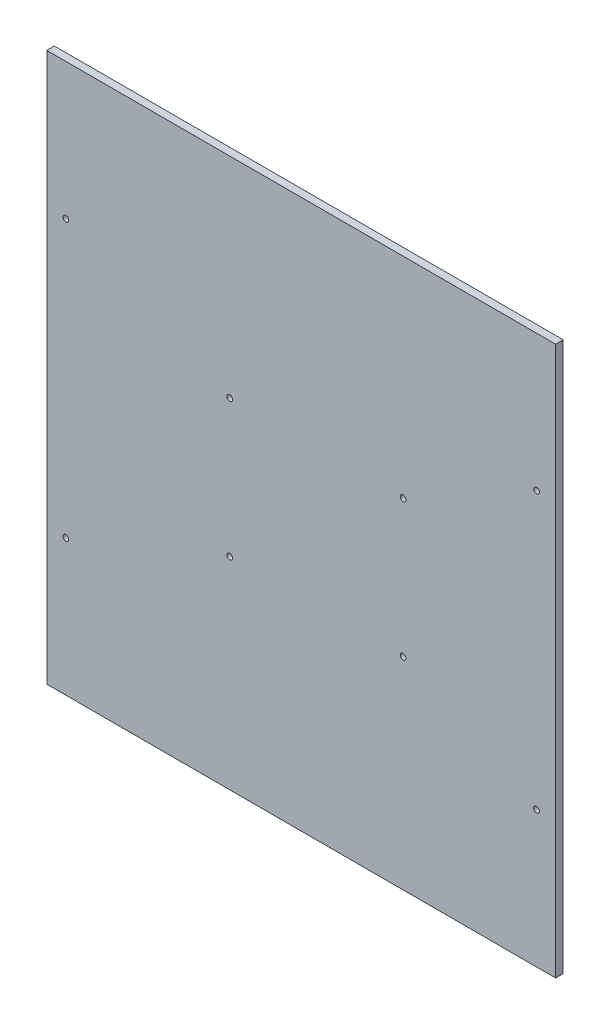
ISO-10303-21;
HEADER;
FILE_DESCRIPTION(('STEP AP214'),'2;1');
FILE_NAME('part.step','',(''),(''),'','','');
FILE_SCHEMA(('AUTOMOTIVE_DESIGN { 1 0 10303 214 1 1 1 1 }'));
ENDSEC;
DATA;
#1=APPLICATION_CONTEXT('core data for automotive mechanical design processes');
#2=APPLICATION_PROTOCOL_DEFINITION('international standard','automotive_design',2000,#1);
#3=PRODUCT_CONTEXT('',#1,'mechanical');
#4=PRODUCT('Part','Part','',(#3));
#5=PRODUCT_RELATED_PRODUCT_CATEGORY('part','',(#4));
#6=PRODUCT_DEFINITION_FORMATION('','',#4);
#7=PRODUCT_DEFINITION_CONTEXT('part definition',#1,'design');
#8=PRODUCT_DEFINITION('design','',#6,#7);
#9=PRODUCT_DEFINITION_SHAPE('','',#8);
#10=(LENGTH_UNIT() NAMED_UNIT(*) SI_UNIT(.MILLI.,.METRE.));
#11=(NAMED_UNIT(*) PLANE_ANGLE_UNIT() SI_UNIT($,.RADIAN.));
#12=(NAMED_UNIT(*) SI_UNIT($,.STERADIAN.) SOLID_ANGLE_UNIT());
#13=UNCERTAINTY_MEASURE_WITH_UNIT(LENGTH_MEASURE(1.E-05),#10,'distance_accuracy_value','');
#14=(GEOMETRIC_REPRESENTATION_CONTEXT(3) GLOBAL_UNCERTAINTY_ASSIGNED_CONTEXT((#13)) GLOBAL_UNIT_ASSIGNED_CONTEXT((#10,
#11,#12)) REPRESENTATION_CONTEXT('',''));
#15=CARTESIAN_POINT('',(0.,0.,0.));
#16=DIRECTION('',(0.,0.,1.));
#17=DIRECTION('',(1.,0.,0.));
#18=AXIS2_PLACEMENT_3D('',#15,#16,#17);
#19=CARTESIAN_POINT('',(-9.99999999999998,-34.3558338694737,4.));
#20=DIRECTION('',(0.,0.,1.));
#21=DIRECTION('',(1.,0.,0.));
#22=AXIS2_PLACEMENT_3D('',#19,#20,#21);
#23=PLANE('',#22);
#24=CARTESIAN_POINT('',(86.0000000000001,71.6441661305263,4.));
#25=DIRECTION('',(0.,0.,1.));
#26=DIRECTION('',(1.,0.,0.));
#27=AXIS2_PLACEMENT_3D('',#24,#25,#26);
#28=CIRCLE('',#27,1.5);
#29=CARTESIAN_POINT('',(87.5000000000001,71.6441661305263,4.));
#30=VERTEX_POINT('',#29);
#31=EDGE_CURVE('E127',#30,#30,#28,.T.);
#32=ORIENTED_EDGE('',*,*,#31,.F.);
#33=EDGE_LOOP('',(#32));
#34=FACE_BOUND('',#33,.T.);
#35=CARTESIAN_POINT('',(177.,71.6441661305263,4.));
#36=DIRECTION('',(0.,0.,1.));
#37=DIRECTION('',(1.,0.,0.));
#38=AXIS2_PLACEMENT_3D('',#35,#36,#37);
#39=CIRCLE('',#38,1.5);
#40=CARTESIAN_POINT('',(178.5,71.6441661305263,4.));
#41=VERTEX_POINT('',#40);
#42=EDGE_CURVE('E117',#41,#41,#39,.T.);
#43=ORIENTED_EDGE('',*,*,#42,.F.);
#44=EDGE_LOOP('',(#43));
#45=FACE_BOUND('',#44,.T.);
#46=CARTESIAN_POINT('',(177.,143.644166130526,4.));
#47=DIRECTION('',(0.,0.,1.));
#48=DIRECTION('',(1.,0.,0.));
#49=AXIS2_PLACEMENT_3D('',#46,#47,#48);
#50=CIRCLE('',#49,1.5);
#51=CARTESIAN_POINT('',(178.5,143.644166130526,4.));
#52=VERTEX_POINT('',#51);
#53=EDGE_CURVE('E114',#52,#52,#50,.T.);
#54=ORIENTED_EDGE('',*,*,#53,.F.);
#55=EDGE_LOOP('',(#54));
#56=FACE_BOUND('',#55,.T.);
#57=CARTESIAN_POINT('',(86.,143.644166130526,4.));
#58=DIRECTION('',(0.,0.,1.));
#59=DIRECTION('',(1.,0.,0.));
#60=AXIS2_PLACEMENT_3D('',#57,#58,#59);
#61=CIRCLE('',#60,1.5);
#62=CARTESIAN_POINT('',(87.5000000000001,143.644166130526,4.));
#63=VERTEX_POINT('',#62);
#64=EDGE_CURVE('E111',#63,#63,#61,.T.);
#65=ORIENTED_EDGE('',*,*,#64,.F.);
#66=EDGE_LOOP('',(#65));
#67=FACE_BOUND('',#66,.T.);
#68=CARTESIAN_POINT('',(247.,37.1441661305263,4.));
#69=DIRECTION('',(0.,0.,1.));
#70=DIRECTION('',(1.,0.,0.));
#71=AXIS2_PLACEMENT_3D('',#68,#69,#70);
#72=CIRCLE('',#71,1.50000000000003);
#73=CARTESIAN_POINT('',(248.5,37.1441661305263,4.));
#74=VERTEX_POINT('',#73);
#75=EDGE_CURVE('E138',#74,#74,#72,.T.);
#76=ORIENTED_EDGE('',*,*,#75,.F.);
#77=EDGE_LOOP('',(#76));
#78=FACE_BOUND('',#77,.T.);
#79=CARTESIAN_POINT('',(0.,182.144166130526,4.));
#80=DIRECTION('',(0.,0.,1.));
#81=DIRECTION('',(1.,0.,0.));
#82=AXIS2_PLACEMENT_3D('',#79,#80,#81);
#83=CIRCLE('',#82,1.5);
#84=CARTESIAN_POINT('',(1.5,182.144166130526,4.));
#85=VERTEX_POINT('',#84);
#86=EDGE_CURVE('E101',#85,#85,#83,.T.);
#87=ORIENTED_EDGE('',*,*,#86,.F.);
#88=EDGE_LOOP('',(#87));
#89=FACE_BOUND('',#88,.T.);
#90=DIRECTION('',(0.,-1.,0.));
#91=VECTOR('',#90,1.);
#92=CARTESIAN_POINT('',(-10.,253.644166130526,4.));
#93=LINE('',#92,#91);
#94=CARTESIAN_POINT('',(-10.,253.644166130526,4.));
#95=VERTEX_POINT('',#94);
#96=CARTESIAN_POINT('',(-9.99999999999998,-34.3558338694737,4.));
#97=VERTEX_POINT('',#96);
#98=EDGE_CURVE('E85',#95,#97,#93,.T.);
#99=ORIENTED_EDGE('',*,*,#98,.T.);
#100=DIRECTION('',(1.,0.,0.));
#101=VECTOR('',#100,1.);
#102=CARTESIAN_POINT('',(-9.99999999999998,-34.3558338694737,4.));
#103=LINE('',#102,#101);
#104=CARTESIAN_POINT('',(257.,-34.3558338694737,4.));
#105=VERTEX_POINT('',#104);
#106=EDGE_CURVE('E80',#97,#105,#103,.T.);
#107=ORIENTED_EDGE('',*,*,#106,.T.);
#108=DIRECTION('',(0.,1.,0.));
#109=VECTOR('',#108,1.);
#110=CARTESIAN_POINT('',(257.,253.644166130526,4.));
#111=LINE('',#110,#109);
#112=CARTESIAN_POINT('',(257.,253.644166130526,4.));
#113=VERTEX_POINT('',#112);
#114=EDGE_CURVE('E83',#105,#113,#111,.T.);
#115=ORIENTED_EDGE('',*,*,#114,.T.);
#116=DIRECTION('',(-1.,0.,0.));
#117=VECTOR('',#116,1.);
#118=CARTESIAN_POINT('',(-10.,253.644166130526,4.));
#119=LINE('',#118,#117);
#120=EDGE_CURVE('E50',#113,#95,#119,.T.);
#121=ORIENTED_EDGE('',*,*,#120,.T.);
#122=EDGE_LOOP('',(#99,#107,#115,#121));
#123=FACE_BOUND('',#122,.T.);
#124=CARTESIAN_POINT('',(0.,37.1441661305263,4.));
#125=DIRECTION('',(0.,0.,1.));
#126=DIRECTION('',(1.,0.,0.));
#127=AXIS2_PLACEMENT_3D('',#124,#125,#126);
#128=CIRCLE('',#127,1.5);
#129=CARTESIAN_POINT('',(1.50000000000002,37.1441661305263,4.));
#130=VERTEX_POINT('',#129);
#131=EDGE_CURVE('E144',#130,#130,#128,.T.);
#132=ORIENTED_EDGE('',*,*,#131,.F.);
#133=EDGE_LOOP('',(#132));
#134=FACE_BOUND('',#133,.T.);
#135=CARTESIAN_POINT('',(247.,182.144166130526,4.));
#136=DIRECTION('',(0.,0.,1.));
#137=DIRECTION('',(1.,0.,0.));
#138=AXIS2_PLACEMENT_3D('',#135,#136,#137);
#139=CIRCLE('',#138,1.50000000000002);
#140=CARTESIAN_POINT('',(248.5,182.144166130526,4.));
#141=VERTEX_POINT('',#140);
#142=EDGE_CURVE('E132',#141,#141,#139,.T.);
#143=ORIENTED_EDGE('',*,*,#142,.F.);
#144=EDGE_LOOP('',(#143));
#145=FACE_BOUND('',#144,.T.);
#146=ADVANCED_FACE('F31',(#34,#45,#56,#67,#78,#89,#123,#134,#145),#23,.T.);
#147=CARTESIAN_POINT('',(-9.99999999999998,-34.3558338694737,0.));
#148=DIRECTION('',(0.,0.,1.));
#149=DIRECTION('',(1.,0.,0.));
#150=AXIS2_PLACEMENT_3D('',#147,#148,#149);
#151=PLANE('',#150);
#152=CARTESIAN_POINT('',(86.0000000000001,71.6441661305263,0.));
#153=DIRECTION('',(0.,0.,1.));
#154=DIRECTION('',(1.,0.,0.));
#155=AXIS2_PLACEMENT_3D('',#152,#153,#154);
#156=CIRCLE('',#155,1.5);
#157=CARTESIAN_POINT('',(87.5000000000001,71.6441661305263,0.));
#158=VERTEX_POINT('',#157);
#159=EDGE_CURVE('E35',#158,#158,#156,.T.);
#160=ORIENTED_EDGE('',*,*,#159,.T.);
#161=EDGE_LOOP('',(#160));
#162=FACE_BOUND('',#161,.T.);
#163=CARTESIAN_POINT('',(177.,71.6441661305263,0.));
#164=DIRECTION('',(0.,0.,1.));
#165=DIRECTION('',(1.,0.,0.));
#166=AXIS2_PLACEMENT_3D('',#163,#164,#165);
#167=CIRCLE('',#166,1.5);
#168=CARTESIAN_POINT('',(178.5,71.6441661305263,0.));
#169=VERTEX_POINT('',#168);
#170=EDGE_CURVE('E115',#169,#169,#167,.T.);
#171=ORIENTED_EDGE('',*,*,#170,.T.);
#172=EDGE_LOOP('',(#171));
#173=FACE_BOUND('',#172,.T.);
#174=CARTESIAN_POINT('',(177.,143.644166130526,0.));
#175=DIRECTION('',(0.,0.,1.));
#176=DIRECTION('',(1.,0.,0.));
#177=AXIS2_PLACEMENT_3D('',#174,#175,#176);
#178=CIRCLE('',#177,1.5);
#179=CARTESIAN_POINT('',(178.5,143.644166130526,0.));
#180=VERTEX_POINT('',#179);
#181=EDGE_CURVE('E112',#180,#180,#178,.T.);
#182=ORIENTED_EDGE('',*,*,#181,.T.);
#183=EDGE_LOOP('',(#182));
#184=FACE_BOUND('',#183,.T.);
#185=CARTESIAN_POINT('',(86.,143.644166130526,0.));
#186=DIRECTION('',(0.,0.,1.));
#187=DIRECTION('',(1.,0.,0.));
#188=AXIS2_PLACEMENT_3D('',#185,#186,#187);
#189=CIRCLE('',#188,1.5);
#190=CARTESIAN_POINT('',(87.5000000000001,143.644166130526,0.));
#191=VERTEX_POINT('',#190);
#192=EDGE_CURVE('E107',#191,#191,#189,.T.);
#193=ORIENTED_EDGE('',*,*,#192,.T.);
#194=EDGE_LOOP('',(#193));
#195=FACE_BOUND('',#194,.T.);
#196=CARTESIAN_POINT('',(247.,37.1441661305263,0.));
#197=DIRECTION('',(0.,0.,1.));
#198=DIRECTION('',(1.,0.,0.));
#199=AXIS2_PLACEMENT_3D('',#196,#197,#198);
#200=CIRCLE('',#199,1.50000000000003);
#201=CARTESIAN_POINT('',(248.5,37.1441661305263,0.));
#202=VERTEX_POINT('',#201);
#203=EDGE_CURVE('E135',#202,#202,#200,.T.);
#204=ORIENTED_EDGE('',*,*,#203,.T.);
#205=EDGE_LOOP('',(#204));
#206=FACE_BOUND('',#205,.T.);
#207=CARTESIAN_POINT('',(0.,182.144166130526,0.));
#208=DIRECTION('',(0.,0.,1.));
#209=DIRECTION('',(1.,0.,0.));
#210=AXIS2_PLACEMENT_3D('',#207,#208,#209);
#211=CIRCLE('',#210,1.5);
#212=CARTESIAN_POINT('',(1.5,182.144166130526,0.));
#213=VERTEX_POINT('',#212);
#214=EDGE_CURVE('E147',#213,#213,#211,.T.);
#215=ORIENTED_EDGE('',*,*,#214,.T.);
#216=EDGE_LOOP('',(#215));
#217=FACE_BOUND('',#216,.T.);
#218=DIRECTION('',(0.,-1.,0.));
#219=VECTOR('',#218,1.);
#220=CARTESIAN_POINT('',(-10.,253.644166130526,0.));
#221=LINE('',#220,#219);
#222=CARTESIAN_POINT('',(-10.,253.644166130526,0.));
#223=VERTEX_POINT('',#222);
#224=CARTESIAN_POINT('',(-9.99999999999998,-34.3558338694737,0.));
#225=VERTEX_POINT('',#224);
#226=EDGE_CURVE('E98',#223,#225,#221,.T.);
#227=ORIENTED_EDGE('',*,*,#226,.F.);
#228=DIRECTION('',(-1.,0.,0.));
#229=VECTOR('',#228,1.);
#230=CARTESIAN_POINT('',(-10.,253.644166130526,0.));
#231=LINE('',#230,#229);
#232=CARTESIAN_POINT('',(257.,253.644166130526,0.));
#233=VERTEX_POINT('',#232);
#234=EDGE_CURVE('E73',#233,#223,#231,.T.);
#235=ORIENTED_EDGE('',*,*,#234,.F.);
#236=DIRECTION('',(0.,1.,0.));
#237=VECTOR('',#236,1.);
#238=CARTESIAN_POINT('',(257.,253.644166130526,0.));
#239=LINE('',#238,#237);
#240=CARTESIAN_POINT('',(257.,-34.3558338694737,0.));
#241=VERTEX_POINT('',#240);
#242=EDGE_CURVE('E67',#241,#233,#239,.T.);
#243=ORIENTED_EDGE('',*,*,#242,.F.);
#244=DIRECTION('',(1.,0.,0.));
#245=VECTOR('',#244,1.);
#246=CARTESIAN_POINT('',(-9.99999999999998,-34.3558338694737,0.));
#247=LINE('',#246,#245);
#248=EDGE_CURVE('E89',#225,#241,#247,.T.);
#249=ORIENTED_EDGE('',*,*,#248,.F.);
#250=EDGE_LOOP('',(#227,#235,#243,#249));
#251=FACE_BOUND('',#250,.T.);
#252=CARTESIAN_POINT('',(0.,37.1441661305263,0.));
#253=DIRECTION('',(0.,0.,1.));
#254=DIRECTION('',(1.,0.,0.));
#255=AXIS2_PLACEMENT_3D('',#252,#253,#254);
#256=CIRCLE('',#255,1.5);
#257=CARTESIAN_POINT('',(1.50000000000002,37.1441661305263,0.));
#258=VERTEX_POINT('',#257);
#259=EDGE_CURVE('E141',#258,#258,#256,.T.);
#260=ORIENTED_EDGE('',*,*,#259,.T.);
#261=EDGE_LOOP('',(#260));
#262=FACE_BOUND('',#261,.T.);
#263=CARTESIAN_POINT('',(247.,182.144166130526,0.));
#264=DIRECTION('',(0.,0.,1.));
#265=DIRECTION('',(1.,0.,0.));
#266=AXIS2_PLACEMENT_3D('',#263,#264,#265);
#267=CIRCLE('',#266,1.50000000000002);
#268=CARTESIAN_POINT('',(248.5,182.144166130526,0.));
#269=VERTEX_POINT('',#268);
#270=EDGE_CURVE('E110',#269,#269,#267,.T.);
#271=ORIENTED_EDGE('',*,*,#270,.T.);
#272=EDGE_LOOP('',(#271));
#273=FACE_BOUND('',#272,.T.);
#274=ADVANCED_FACE('F155',(#162,#173,#184,#195,#206,#217,#251,#262,#273),#151,.F.);
#275=CARTESIAN_POINT('',(-10.,253.644166130526,4.));
#276=DIRECTION('',(1.,0.,0.));
#277=DIRECTION('',(0.,1.,0.));
#278=AXIS2_PLACEMENT_3D('',#275,#276,#277);
#279=PLANE('',#278);
#280=ORIENTED_EDGE('',*,*,#226,.T.);
#281=DIRECTION('',(0.,0.,-1.));
#282=VECTOR('',#281,1.);
#283=CARTESIAN_POINT('',(-9.99999999999998,-34.3558338694737,4.));
#284=LINE('',#283,#282);
#285=EDGE_CURVE('E11',#97,#225,#284,.T.);
#286=ORIENTED_EDGE('',*,*,#285,.F.);
#287=ORIENTED_EDGE('',*,*,#98,.F.);
#288=DIRECTION('',(0.,0.,-1.));
#289=VECTOR('',#288,1.);
#290=CARTESIAN_POINT('',(-10.,253.644166130526,4.));
#291=LINE('',#290,#289);
#292=EDGE_CURVE('E94',#95,#223,#291,.T.);
#293=ORIENTED_EDGE('',*,*,#292,.T.);
#294=EDGE_LOOP('',(#280,#286,#287,#293));
#295=FACE_BOUND('',#294,.T.);
#296=ADVANCED_FACE('F33',(#295),#279,.F.);
#297=CARTESIAN_POINT('',(-9.99999999999998,-34.3558338694737,4.));
#298=DIRECTION('',(0.,1.,0.));
#299=DIRECTION('',(0.,0.,1.));
#300=AXIS2_PLACEMENT_3D('',#297,#298,#299);
#301=PLANE('',#300);
#302=ORIENTED_EDGE('',*,*,#248,.T.);
#303=DIRECTION('',(0.,0.,-1.));
#304=VECTOR('',#303,1.);
#305=CARTESIAN_POINT('',(257.,-34.3558338694737,4.));
#306=LINE('',#305,#304);
#307=EDGE_CURVE('E41',#105,#241,#306,.T.);
#308=ORIENTED_EDGE('',*,*,#307,.F.);
#309=ORIENTED_EDGE('',*,*,#106,.F.);
#310=ORIENTED_EDGE('',*,*,#285,.T.);
#311=EDGE_LOOP('',(#302,#308,#309,#310));
#312=FACE_BOUND('',#311,.T.);
#313=ADVANCED_FACE('F88',(#312),#301,.F.);
#314=CARTESIAN_POINT('',(257.,253.644166130526,4.));
#315=DIRECTION('',(-1.,0.,0.));
#316=DIRECTION('',(0.,-1.,0.));
#317=AXIS2_PLACEMENT_3D('',#314,#315,#316);
#318=PLANE('',#317);
#319=ORIENTED_EDGE('',*,*,#242,.T.);
#320=DIRECTION('',(0.,0.,-1.));
#321=VECTOR('',#320,1.);
#322=CARTESIAN_POINT('',(257.,253.644166130526,4.));
#323=LINE('',#322,#321);
#324=EDGE_CURVE('E90',#113,#233,#323,.T.);
#325=ORIENTED_EDGE('',*,*,#324,.F.);
#326=ORIENTED_EDGE('',*,*,#114,.F.);
#327=ORIENTED_EDGE('',*,*,#307,.T.);
#328=EDGE_LOOP('',(#319,#325,#326,#327));
#329=FACE_BOUND('',#328,.T.);
#330=ADVANCED_FACE('F92',(#329),#318,.F.);
#331=CARTESIAN_POINT('',(-10.,253.644166130526,4.));
#332=DIRECTION('',(0.,-1.,0.));
#333=DIRECTION('',(0.,0.,-1.));
#334=AXIS2_PLACEMENT_3D('',#331,#332,#333);
#335=PLANE('',#334);
#336=ORIENTED_EDGE('',*,*,#234,.T.);
#337=ORIENTED_EDGE('',*,*,#292,.F.);
#338=ORIENTED_EDGE('',*,*,#120,.F.);
#339=ORIENTED_EDGE('',*,*,#324,.T.);
#340=EDGE_LOOP('',(#336,#337,#338,#339));
#341=FACE_BOUND('',#340,.T.);
#342=ADVANCED_FACE('F161',(#341),#335,.F.);
#343=CARTESIAN_POINT('',(0.,182.144166130526,4.));
#344=DIRECTION('',(0.,0.,-1.));
#345=DIRECTION('',(-1.,0.,0.));
#346=AXIS2_PLACEMENT_3D('',#343,#344,#345);
#347=CYLINDRICAL_SURFACE('',#346,1.5);
#348=ORIENTED_EDGE('',*,*,#86,.T.);
#349=EDGE_LOOP('',(#348));
#350=FACE_BOUND('',#349,.T.);
#351=ORIENTED_EDGE('',*,*,#214,.F.);
#352=EDGE_LOOP('',(#351));
#353=FACE_BOUND('',#352,.T.);
#354=ADVANCED_FACE('F158',(#350,#353),#347,.F.);
#355=CARTESIAN_POINT('',(0.,37.1441661305263,4.));
#356=DIRECTION('',(0.,0.,-1.));
#357=DIRECTION('',(-1.,0.,0.));
#358=AXIS2_PLACEMENT_3D('',#355,#356,#357);
#359=CYLINDRICAL_SURFACE('',#358,1.5);
#360=ORIENTED_EDGE('',*,*,#131,.T.);
#361=EDGE_LOOP('',(#360));
#362=FACE_BOUND('',#361,.T.);
#363=ORIENTED_EDGE('',*,*,#259,.F.);
#364=EDGE_LOOP('',(#363));
#365=FACE_BOUND('',#364,.T.);
#366=ADVANCED_FACE('F160',(#362,#365),#359,.F.);
#367=CARTESIAN_POINT('',(247.,37.1441661305263,4.));
#368=DIRECTION('',(0.,0.,-1.));
#369=DIRECTION('',(-1.,0.,0.));
#370=AXIS2_PLACEMENT_3D('',#367,#368,#369);
#371=CYLINDRICAL_SURFACE('',#370,1.50000000000003);
#372=ORIENTED_EDGE('',*,*,#75,.T.);
#373=EDGE_LOOP('',(#372));
#374=FACE_BOUND('',#373,.T.);
#375=ORIENTED_EDGE('',*,*,#203,.F.);
#376=EDGE_LOOP('',(#375));
#377=FACE_BOUND('',#376,.T.);
#378=ADVANCED_FACE('F168',(#374,#377),#371,.F.);
#379=CARTESIAN_POINT('',(247.,182.144166130526,4.));
#380=DIRECTION('',(0.,0.,-1.));
#381=DIRECTION('',(-1.,0.,0.));
#382=AXIS2_PLACEMENT_3D('',#379,#380,#381);
#383=CYLINDRICAL_SURFACE('',#382,1.50000000000002);
#384=ORIENTED_EDGE('',*,*,#142,.T.);
#385=EDGE_LOOP('',(#384));
#386=FACE_BOUND('',#385,.T.);
#387=ORIENTED_EDGE('',*,*,#270,.F.);
#388=EDGE_LOOP('',(#387));
#389=FACE_BOUND('',#388,.T.);
#390=ADVANCED_FACE('F199',(#386,#389),#383,.F.);
#391=CARTESIAN_POINT('',(86.,143.644166130526,-6.));
#392=DIRECTION('',(0.,0.,1.));
#393=DIRECTION('',(1.,0.,0.));
#394=AXIS2_PLACEMENT_3D('',#391,#392,#393);
#395=CYLINDRICAL_SURFACE('',#394,1.5);
#396=ORIENTED_EDGE('',*,*,#64,.T.);
#397=EDGE_LOOP('',(#396));
#398=FACE_BOUND('',#397,.T.);
#399=ORIENTED_EDGE('',*,*,#192,.F.);
#400=EDGE_LOOP('',(#399));
#401=FACE_BOUND('',#400,.T.);
#402=ADVANCED_FACE('F201',(#398,#401),#395,.F.);
#403=CARTESIAN_POINT('',(177.,143.644166130526,-6.));
#404=DIRECTION('',(0.,0.,1.));
#405=DIRECTION('',(1.,0.,0.));
#406=AXIS2_PLACEMENT_3D('',#403,#404,#405);
#407=CYLINDRICAL_SURFACE('',#406,1.5);
#408=ORIENTED_EDGE('',*,*,#53,.T.);
#409=EDGE_LOOP('',(#408));
#410=FACE_BOUND('',#409,.T.);
#411=ORIENTED_EDGE('',*,*,#181,.F.);
#412=EDGE_LOOP('',(#411));
#413=FACE_BOUND('',#412,.T.);
#414=ADVANCED_FACE('F207',(#410,#413),#407,.F.);
#415=CARTESIAN_POINT('',(177.,71.6441661305263,-6.));
#416=DIRECTION('',(0.,0.,1.));
#417=DIRECTION('',(1.,0.,0.));
#418=AXIS2_PLACEMENT_3D('',#415,#416,#417);
#419=CYLINDRICAL_SURFACE('',#418,1.5);
#420=ORIENTED_EDGE('',*,*,#42,.T.);
#421=EDGE_LOOP('',(#420));
#422=FACE_BOUND('',#421,.T.);
#423=ORIENTED_EDGE('',*,*,#170,.F.);
#424=EDGE_LOOP('',(#423));
#425=FACE_BOUND('',#424,.T.);
#426=ADVANCED_FACE('F215',(#422,#425),#419,.F.);
#427=CARTESIAN_POINT('',(86.0000000000001,71.6441661305263,-6.));
#428=DIRECTION('',(0.,0.,1.));
#429=DIRECTION('',(1.,0.,0.));
#430=AXIS2_PLACEMENT_3D('',#427,#428,#429);
#431=CYLINDRICAL_SURFACE('',#430,1.5);
#432=ORIENTED_EDGE('',*,*,#31,.T.);
#433=EDGE_LOOP('',(#432));
#434=FACE_BOUND('',#433,.T.);
#435=ORIENTED_EDGE('',*,*,#159,.F.);
#436=EDGE_LOOP('',(#435));
#437=FACE_BOUND('',#436,.T.);
#438=ADVANCED_FACE('F219',(#434,#437),#431,.F.);
#439=CLOSED_SHELL('',(#146,#274,#296,#313,#330,#342,#354,#366,#378,#390,#402,#414,#426,#438));
#440=MANIFOLD_SOLID_BREP('B2',#439);
#441=ADVANCED_BREP_SHAPE_REPRESENTATION('',(#18,#440),#14);
#442=SHAPE_DEFINITION_REPRESENTATION(#9,#441);
ENDSEC;
END-ISO-10303-21;
